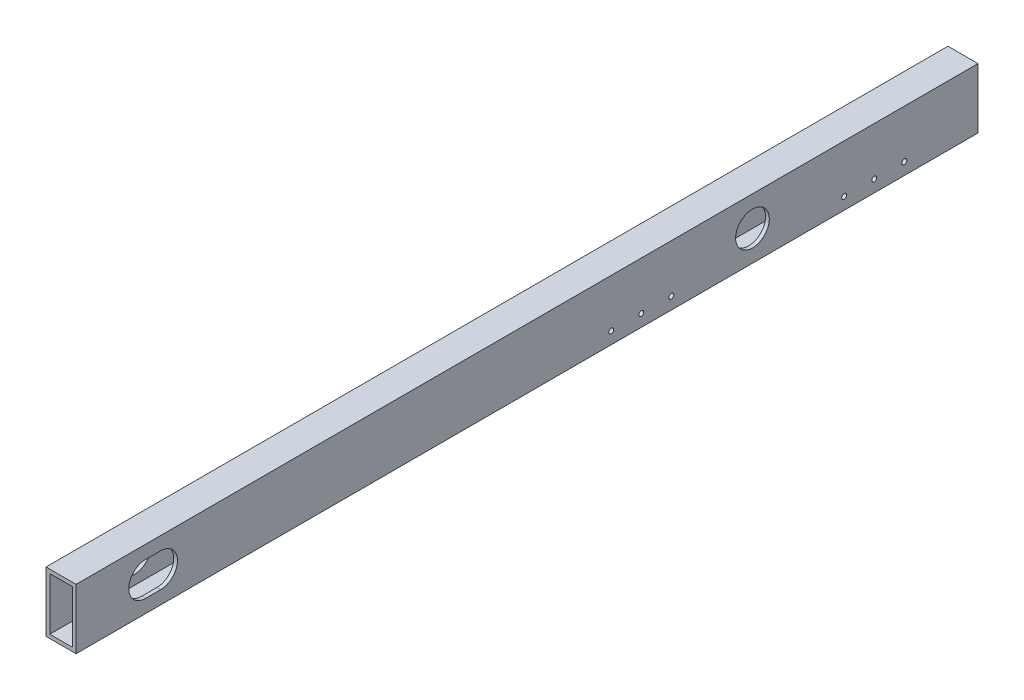
ISO-10303-21;
HEADER;
FILE_DESCRIPTION(('STEP AP214'),'2;1');
FILE_NAME('part.step','',(''),(''),'','','');
FILE_SCHEMA(('AUTOMOTIVE_DESIGN { 1 0 10303 214 1 1 1 1 }'));
ENDSEC;
DATA;
#1=APPLICATION_CONTEXT('core data for automotive mechanical design processes');
#2=APPLICATION_PROTOCOL_DEFINITION('international standard','automotive_design',2000,#1);
#3=PRODUCT_CONTEXT('',#1,'mechanical');
#4=PRODUCT('Part','Part','',(#3));
#5=PRODUCT_RELATED_PRODUCT_CATEGORY('part','',(#4));
#6=PRODUCT_DEFINITION_FORMATION('','',#4);
#7=PRODUCT_DEFINITION_CONTEXT('part definition',#1,'design');
#8=PRODUCT_DEFINITION('design','',#6,#7);
#9=PRODUCT_DEFINITION_SHAPE('','',#8);
#10=(LENGTH_UNIT() NAMED_UNIT(*) SI_UNIT(.MILLI.,.METRE.));
#11=(NAMED_UNIT(*) PLANE_ANGLE_UNIT() SI_UNIT($,.RADIAN.));
#12=(NAMED_UNIT(*) SI_UNIT($,.STERADIAN.) SOLID_ANGLE_UNIT());
#13=UNCERTAINTY_MEASURE_WITH_UNIT(LENGTH_MEASURE(1.E-05),#10,'distance_accuracy_value','');
#14=(GEOMETRIC_REPRESENTATION_CONTEXT(3) GLOBAL_UNCERTAINTY_ASSIGNED_CONTEXT((#13)) GLOBAL_UNIT_ASSIGNED_CONTEXT((#10,
#11,#12)) REPRESENTATION_CONTEXT('',''));
#15=CARTESIAN_POINT('',(0.,0.,0.));
#16=DIRECTION('',(0.,0.,1.));
#17=DIRECTION('',(1.,0.,0.));
#18=AXIS2_PLACEMENT_3D('',#15,#16,#17);
#19=CARTESIAN_POINT('',(0.,0.,762.));
#20=DIRECTION('',(0.,0.,1.));
#21=DIRECTION('',(1.,0.,0.));
#22=AXIS2_PLACEMENT_3D('',#19,#20,#21);
#23=PLANE('',#22);
#24=DIRECTION('',(0.,1.,0.));
#25=VECTOR('',#24,1.);
#26=CARTESIAN_POINT('',(12.7,25.4,762.));
#27=LINE('',#26,#25);
#28=CARTESIAN_POINT('',(12.7,-25.4,762.));
#29=VERTEX_POINT('',#28);
#30=CARTESIAN_POINT('',(12.7,25.4,762.));
#31=VERTEX_POINT('',#30);
#32=EDGE_CURVE('E251',#29,#31,#27,.T.);
#33=ORIENTED_EDGE('',*,*,#32,.T.);
#34=DIRECTION('',(-1.,0.,0.));
#35=VECTOR('',#34,1.);
#36=CARTESIAN_POINT('',(-12.7,25.4,762.));
#37=LINE('',#36,#35);
#38=CARTESIAN_POINT('',(-12.7,25.4,762.));
#39=VERTEX_POINT('',#38);
#40=EDGE_CURVE('E255',#31,#39,#37,.T.);
#41=ORIENTED_EDGE('',*,*,#40,.T.);
#42=DIRECTION('',(0.,-1.,0.));
#43=VECTOR('',#42,1.);
#44=CARTESIAN_POINT('',(-12.7,25.4,762.));
#45=LINE('',#44,#43);
#46=CARTESIAN_POINT('',(-12.7,-25.4,762.));
#47=VERTEX_POINT('',#46);
#48=EDGE_CURVE('E259',#39,#47,#45,.T.);
#49=ORIENTED_EDGE('',*,*,#48,.T.);
#50=DIRECTION('',(1.,0.,0.));
#51=VECTOR('',#50,1.);
#52=CARTESIAN_POINT('',(-12.7,-25.4,762.));
#53=LINE('',#52,#51);
#54=EDGE_CURVE('E262',#47,#29,#53,.T.);
#55=ORIENTED_EDGE('',*,*,#54,.T.);
#56=EDGE_LOOP('',(#33,#41,#49,#55));
#57=FACE_BOUND('',#56,.T.);
#58=DIRECTION('',(1.,0.,0.));
#59=VECTOR('',#58,1.);
#60=CARTESIAN_POINT('',(-9.525,-22.225,762.));
#61=LINE('',#60,#59);
#62=CARTESIAN_POINT('',(-9.525,-22.225,762.));
#63=VERTEX_POINT('',#62);
#64=CARTESIAN_POINT('',(9.52500000000002,-22.225,762.));
#65=VERTEX_POINT('',#64);
#66=EDGE_CURVE('E211',#63,#65,#61,.T.);
#67=ORIENTED_EDGE('',*,*,#66,.F.);
#68=DIRECTION('',(0.,-1.,0.));
#69=VECTOR('',#68,1.);
#70=CARTESIAN_POINT('',(-9.52500000000001,22.225,762.));
#71=LINE('',#70,#69);
#72=CARTESIAN_POINT('',(-9.52500000000001,22.225,762.));
#73=VERTEX_POINT('',#72);
#74=EDGE_CURVE('E208',#73,#63,#71,.T.);
#75=ORIENTED_EDGE('',*,*,#74,.F.);
#76=DIRECTION('',(-1.,0.,0.));
#77=VECTOR('',#76,1.);
#78=CARTESIAN_POINT('',(-9.52500000000001,22.225,762.));
#79=LINE('',#78,#77);
#80=CARTESIAN_POINT('',(9.52500000000001,22.225,762.));
#81=VERTEX_POINT('',#80);
#82=EDGE_CURVE('E219',#81,#73,#79,.T.);
#83=ORIENTED_EDGE('',*,*,#82,.F.);
#84=DIRECTION('',(0.,1.,0.));
#85=VECTOR('',#84,1.);
#86=CARTESIAN_POINT('',(9.52500000000001,22.225,762.));
#87=LINE('',#86,#85);
#88=EDGE_CURVE('E215',#65,#81,#87,.T.);
#89=ORIENTED_EDGE('',*,*,#88,.F.);
#90=EDGE_LOOP('',(#67,#75,#83,#89));
#91=FACE_BOUND('',#90,.T.);
#92=ADVANCED_FACE('F39',(#57,#91),#23,.T.);
#93=CARTESIAN_POINT('',(0.,0.,0.));
#94=DIRECTION('',(0.,0.,1.));
#95=DIRECTION('',(1.,0.,0.));
#96=AXIS2_PLACEMENT_3D('',#93,#94,#95);
#97=PLANE('',#96);
#98=DIRECTION('',(0.,1.,0.));
#99=VECTOR('',#98,1.);
#100=CARTESIAN_POINT('',(12.7,25.4,0.));
#101=LINE('',#100,#99);
#102=CARTESIAN_POINT('',(12.7,-25.4,0.));
#103=VERTEX_POINT('',#102);
#104=CARTESIAN_POINT('',(12.7,25.4,0.));
#105=VERTEX_POINT('',#104);
#106=EDGE_CURVE('E250',#103,#105,#101,.T.);
#107=ORIENTED_EDGE('',*,*,#106,.F.);
#108=DIRECTION('',(1.,0.,0.));
#109=VECTOR('',#108,1.);
#110=CARTESIAN_POINT('',(-12.7,-25.4,0.));
#111=LINE('',#110,#109);
#112=CARTESIAN_POINT('',(-12.7,-25.4,0.));
#113=VERTEX_POINT('',#112);
#114=EDGE_CURVE('E256',#113,#103,#111,.T.);
#115=ORIENTED_EDGE('',*,*,#114,.F.);
#116=DIRECTION('',(0.,-1.,0.));
#117=VECTOR('',#116,1.);
#118=CARTESIAN_POINT('',(-12.7,25.4,0.));
#119=LINE('',#118,#117);
#120=CARTESIAN_POINT('',(-12.7,25.4,0.));
#121=VERTEX_POINT('',#120);
#122=EDGE_CURVE('E272',#121,#113,#119,.T.);
#123=ORIENTED_EDGE('',*,*,#122,.F.);
#124=DIRECTION('',(-1.,0.,0.));
#125=VECTOR('',#124,1.);
#126=CARTESIAN_POINT('',(-12.7,25.4,0.));
#127=LINE('',#126,#125);
#128=EDGE_CURVE('E269',#105,#121,#127,.T.);
#129=ORIENTED_EDGE('',*,*,#128,.F.);
#130=EDGE_LOOP('',(#107,#115,#123,#129));
#131=FACE_BOUND('',#130,.T.);
#132=DIRECTION('',(0.,-1.,0.));
#133=VECTOR('',#132,1.);
#134=CARTESIAN_POINT('',(-9.52500000000001,22.225,0.));
#135=LINE('',#134,#133);
#136=CARTESIAN_POINT('',(-9.52500000000001,22.225,0.));
#137=VERTEX_POINT('',#136);
#138=CARTESIAN_POINT('',(-9.525,-22.225,0.));
#139=VERTEX_POINT('',#138);
#140=EDGE_CURVE('E207',#137,#139,#135,.T.);
#141=ORIENTED_EDGE('',*,*,#140,.T.);
#142=DIRECTION('',(1.,0.,0.));
#143=VECTOR('',#142,1.);
#144=CARTESIAN_POINT('',(-9.525,-22.225,0.));
#145=LINE('',#144,#143);
#146=CARTESIAN_POINT('',(9.52500000000002,-22.225,0.));
#147=VERTEX_POINT('',#146);
#148=EDGE_CURVE('E226',#139,#147,#145,.T.);
#149=ORIENTED_EDGE('',*,*,#148,.T.);
#150=DIRECTION('',(0.,1.,0.));
#151=VECTOR('',#150,1.);
#152=CARTESIAN_POINT('',(9.52500000000001,22.225,0.));
#153=LINE('',#152,#151);
#154=CARTESIAN_POINT('',(9.52500000000001,22.225,0.));
#155=VERTEX_POINT('',#154);
#156=EDGE_CURVE('E230',#147,#155,#153,.T.);
#157=ORIENTED_EDGE('',*,*,#156,.T.);
#158=DIRECTION('',(-1.,0.,0.));
#159=VECTOR('',#158,1.);
#160=CARTESIAN_POINT('',(-9.52500000000001,22.225,0.));
#161=LINE('',#160,#159);
#162=EDGE_CURVE('E212',#155,#137,#161,.T.);
#163=ORIENTED_EDGE('',*,*,#162,.T.);
#164=EDGE_LOOP('',(#141,#149,#157,#163));
#165=FACE_BOUND('',#164,.T.);
#166=ADVANCED_FACE('F446',(#131,#165),#97,.F.);
#167=CARTESIAN_POINT('',(12.7,25.4,762.));
#168=DIRECTION('',(-1.,0.,0.));
#169=DIRECTION('',(0.,0.,1.));
#170=AXIS2_PLACEMENT_3D('',#167,#168,#169);
#171=PLANE('',#170);
#172=CARTESIAN_POINT('',(12.7,-15.2400000000002,284.48));
#173=DIRECTION('',(1.,0.,0.));
#174=DIRECTION('',(0.,1.,0.));
#175=AXIS2_PLACEMENT_3D('',#172,#173,#174);
#176=CIRCLE('',#175,2.09549999999999);
#177=CARTESIAN_POINT('',(12.7,-13.1445000000002,284.48));
#178=VERTEX_POINT('',#177);
#179=EDGE_CURVE('E502',#178,#178,#176,.T.);
#180=ORIENTED_EDGE('',*,*,#179,.F.);
#181=EDGE_LOOP('',(#180));
#182=FACE_BOUND('',#181,.T.);
#183=CARTESIAN_POINT('',(12.7,-15.2400000000004,309.88));
#184=DIRECTION('',(1.,0.,0.));
#185=DIRECTION('',(0.,1.,0.));
#186=AXIS2_PLACEMENT_3D('',#183,#184,#185);
#187=CIRCLE('',#186,2.09549999999999);
#188=CARTESIAN_POINT('',(12.7,-13.1445000000004,309.88));
#189=VERTEX_POINT('',#188);
#190=EDGE_CURVE('E506',#189,#189,#187,.T.);
#191=ORIENTED_EDGE('',*,*,#190,.F.);
#192=EDGE_LOOP('',(#191));
#193=FACE_BOUND('',#192,.T.);
#194=CARTESIAN_POINT('',(12.7,-15.24,87.63));
#195=DIRECTION('',(1.,0.,0.));
#196=DIRECTION('',(0.,1.,0.));
#197=AXIS2_PLACEMENT_3D('',#194,#195,#196);
#198=CIRCLE('',#197,2.0955);
#199=CARTESIAN_POINT('',(12.7,-13.1445,87.63));
#200=VERTEX_POINT('',#199);
#201=EDGE_CURVE('E510',#200,#200,#198,.T.);
#202=ORIENTED_EDGE('',*,*,#201,.F.);
#203=EDGE_LOOP('',(#202));
#204=FACE_BOUND('',#203,.T.);
#205=CARTESIAN_POINT('',(12.7,-15.24,62.23));
#206=DIRECTION('',(1.,0.,0.));
#207=DIRECTION('',(0.,1.,0.));
#208=AXIS2_PLACEMENT_3D('',#205,#206,#207);
#209=CIRCLE('',#208,2.0955);
#210=CARTESIAN_POINT('',(12.7,-13.1445,62.23));
#211=VERTEX_POINT('',#210);
#212=EDGE_CURVE('E514',#211,#211,#209,.T.);
#213=ORIENTED_EDGE('',*,*,#212,.F.);
#214=EDGE_LOOP('',(#213));
#215=FACE_BOUND('',#214,.T.);
#216=CARTESIAN_POINT('',(12.7,-15.2400000000002,113.03));
#217=DIRECTION('',(1.,0.,0.));
#218=DIRECTION('',(0.,1.,0.));
#219=AXIS2_PLACEMENT_3D('',#216,#217,#218);
#220=CIRCLE('',#219,2.09549999999999);
#221=CARTESIAN_POINT('',(12.7,-13.1445000000002,113.03));
#222=VERTEX_POINT('',#221);
#223=EDGE_CURVE('E518',#222,#222,#220,.T.);
#224=ORIENTED_EDGE('',*,*,#223,.F.);
#225=EDGE_LOOP('',(#224));
#226=FACE_BOUND('',#225,.T.);
#227=CARTESIAN_POINT('',(12.7,-15.24,259.08));
#228=DIRECTION('',(1.,0.,0.));
#229=DIRECTION('',(0.,1.,0.));
#230=AXIS2_PLACEMENT_3D('',#227,#228,#229);
#231=CIRCLE('',#230,2.09549999999999);
#232=CARTESIAN_POINT('',(12.7,-13.1445,259.08));
#233=VERTEX_POINT('',#232);
#234=EDGE_CURVE('E522',#233,#233,#231,.T.);
#235=ORIENTED_EDGE('',*,*,#234,.F.);
#236=EDGE_LOOP('',(#235));
#237=FACE_BOUND('',#236,.T.);
#238=CARTESIAN_POINT('',(12.7,0.,190.549048410685));
#239=DIRECTION('',(1.,0.,0.));
#240=DIRECTION('',(0.,1.,0.));
#241=AXIS2_PLACEMENT_3D('',#238,#239,#240);
#242=CIRCLE('',#241,14.224);
#243=CARTESIAN_POINT('',(12.7,14.224,190.549048410685));
#244=VERTEX_POINT('',#243);
#245=EDGE_CURVE('E394',#244,#244,#242,.T.);
#246=ORIENTED_EDGE('',*,*,#245,.F.);
#247=EDGE_LOOP('',(#246));
#248=FACE_BOUND('',#247,.T.);
#249=DIRECTION('',(0.,0.,-1.));
#250=VECTOR('',#249,1.);
#251=CARTESIAN_POINT('',(12.7,-14.2240000000001,703.248048410685));
#252=LINE('',#251,#250);
#253=CARTESIAN_POINT('',(12.7,-14.2240000000001,703.248048410685));
#254=VERTEX_POINT('',#253);
#255=CARTESIAN_POINT('',(12.7,-14.2240000000001,690.548048410685));
#256=VERTEX_POINT('',#255);
#257=EDGE_CURVE('E418',#254,#256,#252,.T.);
#258=ORIENTED_EDGE('',*,*,#257,.F.);
#259=CARTESIAN_POINT('',(12.7,0.,703.248048410685));
#260=DIRECTION('',(1.,0.,0.));
#261=DIRECTION('',(0.,1.,0.));
#262=AXIS2_PLACEMENT_3D('',#259,#260,#261);
#263=CIRCLE('',#262,14.2240000000001);
#264=CARTESIAN_POINT('',(12.7,14.2240000000001,703.248048410685));
#265=VERTEX_POINT('',#264);
#266=EDGE_CURVE('E57',#265,#254,#263,.T.);
#267=ORIENTED_EDGE('',*,*,#266,.F.);
#268=DIRECTION('',(0.,0.,-1.));
#269=VECTOR('',#268,1.);
#270=CARTESIAN_POINT('',(12.7,14.2240000000001,703.248048410685));
#271=LINE('',#270,#269);
#272=CARTESIAN_POINT('',(12.7,14.224,690.548048410685));
#273=VERTEX_POINT('',#272);
#274=EDGE_CURVE('E406',#265,#273,#271,.T.);
#275=ORIENTED_EDGE('',*,*,#274,.T.);
#276=CARTESIAN_POINT('',(12.7,0.,690.548048410685));
#277=DIRECTION('',(1.,0.,0.));
#278=DIRECTION('',(0.,1.,0.));
#279=AXIS2_PLACEMENT_3D('',#276,#277,#278);
#280=CIRCLE('',#279,14.2240000000001);
#281=EDGE_CURVE('E414',#256,#273,#280,.T.);
#282=ORIENTED_EDGE('',*,*,#281,.F.);
#283=EDGE_LOOP('',(#258,#267,#275,#282));
#284=FACE_BOUND('',#283,.T.);
#285=ORIENTED_EDGE('',*,*,#106,.T.);
#286=DIRECTION('',(0.,0.,-1.));
#287=VECTOR('',#286,1.);
#288=CARTESIAN_POINT('',(12.7,25.4,762.));
#289=LINE('',#288,#287);
#290=EDGE_CURVE('E288',#31,#105,#289,.T.);
#291=ORIENTED_EDGE('',*,*,#290,.F.);
#292=ORIENTED_EDGE('',*,*,#32,.F.);
#293=DIRECTION('',(0.,0.,-1.));
#294=VECTOR('',#293,1.);
#295=CARTESIAN_POINT('',(12.7,-25.4,762.));
#296=LINE('',#295,#294);
#297=EDGE_CURVE('E265',#29,#103,#296,.T.);
#298=ORIENTED_EDGE('',*,*,#297,.T.);
#299=EDGE_LOOP('',(#285,#291,#292,#298));
#300=FACE_BOUND('',#299,.T.);
#301=ADVANCED_FACE('F41',(#182,#193,#204,#215,#226,#237,#248,#284,#300),#171,.F.);
#302=CARTESIAN_POINT('',(-12.7,25.4,762.));
#303=DIRECTION('',(0.,-1.,0.));
#304=DIRECTION('',(0.,0.,-1.));
#305=AXIS2_PLACEMENT_3D('',#302,#303,#304);
#306=PLANE('',#305);
#307=ORIENTED_EDGE('',*,*,#128,.T.);
#308=DIRECTION('',(0.,0.,-1.));
#309=VECTOR('',#308,1.);
#310=CARTESIAN_POINT('',(-12.7,25.4,762.));
#311=LINE('',#310,#309);
#312=EDGE_CURVE('E284',#39,#121,#311,.T.);
#313=ORIENTED_EDGE('',*,*,#312,.F.);
#314=ORIENTED_EDGE('',*,*,#40,.F.);
#315=ORIENTED_EDGE('',*,*,#290,.T.);
#316=EDGE_LOOP('',(#307,#313,#314,#315));
#317=FACE_BOUND('',#316,.T.);
#318=ADVANCED_FACE('F477',(#317),#306,.F.);
#319=CARTESIAN_POINT('',(-12.7,25.4,762.));
#320=DIRECTION('',(1.,0.,0.));
#321=DIRECTION('',(0.,0.,-1.));
#322=AXIS2_PLACEMENT_3D('',#319,#320,#321);
#323=PLANE('',#322);
#324=CARTESIAN_POINT('',(-12.7,-15.2400000000002,284.48));
#325=DIRECTION('',(1.,0.,0.));
#326=DIRECTION('',(0.,0.,-1.));
#327=AXIS2_PLACEMENT_3D('',#324,#325,#326);
#328=CIRCLE('',#327,2.09549999999999);
#329=CARTESIAN_POINT('',(-12.7,-15.2400000000002,282.3845));
#330=VERTEX_POINT('',#329);
#331=EDGE_CURVE('E661',#330,#330,#328,.F.);
#332=ORIENTED_EDGE('',*,*,#331,.F.);
#333=EDGE_LOOP('',(#332));
#334=FACE_BOUND('',#333,.T.);
#335=CARTESIAN_POINT('',(-12.7,-15.2400000000004,309.88));
#336=DIRECTION('',(1.,0.,0.));
#337=DIRECTION('',(0.,0.,-1.));
#338=AXIS2_PLACEMENT_3D('',#335,#336,#337);
#339=CIRCLE('',#338,2.09549999999999);
#340=CARTESIAN_POINT('',(-12.7,-15.2400000000004,307.7845));
#341=VERTEX_POINT('',#340);
#342=EDGE_CURVE('E662',#341,#341,#339,.F.);
#343=ORIENTED_EDGE('',*,*,#342,.F.);
#344=EDGE_LOOP('',(#343));
#345=FACE_BOUND('',#344,.T.);
#346=CARTESIAN_POINT('',(-12.7,-15.24,87.63));
#347=DIRECTION('',(1.,0.,0.));
#348=DIRECTION('',(0.,0.,-1.));
#349=AXIS2_PLACEMENT_3D('',#346,#347,#348);
#350=CIRCLE('',#349,2.0955);
#351=CARTESIAN_POINT('',(-12.7,-15.24,85.5345));
#352=VERTEX_POINT('',#351);
#353=EDGE_CURVE('E668',#352,#352,#350,.F.);
#354=ORIENTED_EDGE('',*,*,#353,.F.);
#355=EDGE_LOOP('',(#354));
#356=FACE_BOUND('',#355,.T.);
#357=CARTESIAN_POINT('',(-12.7,-15.24,62.23));
#358=DIRECTION('',(1.,0.,0.));
#359=DIRECTION('',(0.,0.,-1.));
#360=AXIS2_PLACEMENT_3D('',#357,#358,#359);
#361=CIRCLE('',#360,2.0955);
#362=CARTESIAN_POINT('',(-12.7,-15.24,60.1345));
#363=VERTEX_POINT('',#362);
#364=EDGE_CURVE('E655',#363,#363,#361,.F.);
#365=ORIENTED_EDGE('',*,*,#364,.F.);
#366=EDGE_LOOP('',(#365));
#367=FACE_BOUND('',#366,.T.);
#368=CARTESIAN_POINT('',(-12.7,-15.2400000000002,113.03));
#369=DIRECTION('',(1.,0.,0.));
#370=DIRECTION('',(0.,0.,-1.));
#371=AXIS2_PLACEMENT_3D('',#368,#369,#370);
#372=CIRCLE('',#371,2.09549999999999);
#373=CARTESIAN_POINT('',(-12.7,-15.2400000000002,110.9345));
#374=VERTEX_POINT('',#373);
#375=EDGE_CURVE('E649',#374,#374,#372,.F.);
#376=ORIENTED_EDGE('',*,*,#375,.F.);
#377=EDGE_LOOP('',(#376));
#378=FACE_BOUND('',#377,.T.);
#379=CARTESIAN_POINT('',(-12.7,-15.24,259.08));
#380=DIRECTION('',(1.,0.,0.));
#381=DIRECTION('',(0.,0.,-1.));
#382=AXIS2_PLACEMENT_3D('',#379,#380,#381);
#383=CIRCLE('',#382,2.09549999999999);
#384=CARTESIAN_POINT('',(-12.7,-15.24,256.9845));
#385=VERTEX_POINT('',#384);
#386=EDGE_CURVE('E310',#385,#385,#383,.F.);
#387=ORIENTED_EDGE('',*,*,#386,.F.);
#388=EDGE_LOOP('',(#387));
#389=FACE_BOUND('',#388,.T.);
#390=CARTESIAN_POINT('',(-12.7,0.,190.549048410685));
#391=DIRECTION('',(1.,0.,0.));
#392=DIRECTION('',(0.,0.,-1.));
#393=AXIS2_PLACEMENT_3D('',#390,#391,#392);
#394=CIRCLE('',#393,14.224);
#395=CARTESIAN_POINT('',(-12.7,0.,176.325048410685));
#396=VERTEX_POINT('',#395);
#397=EDGE_CURVE('E192',#396,#396,#394,.F.);
#398=ORIENTED_EDGE('',*,*,#397,.F.);
#399=EDGE_LOOP('',(#398));
#400=FACE_BOUND('',#399,.T.);
#401=DIRECTION('',(0.,0.,1.));
#402=VECTOR('',#401,1.);
#403=CARTESIAN_POINT('',(-12.7,14.224,703.248048410685));
#404=LINE('',#403,#402);
#405=CARTESIAN_POINT('',(-12.7,14.224,690.548048410685));
#406=VERTEX_POINT('',#405);
#407=CARTESIAN_POINT('',(-12.7,14.224,703.248048410685));
#408=VERTEX_POINT('',#407);
#409=EDGE_CURVE('E156',#406,#408,#404,.T.);
#410=ORIENTED_EDGE('',*,*,#409,.T.);
#411=CARTESIAN_POINT('',(-12.7,0.,703.248048410685));
#412=DIRECTION('',(1.,0.,0.));
#413=DIRECTION('',(0.,0.,-1.));
#414=AXIS2_PLACEMENT_3D('',#411,#412,#413);
#415=CIRCLE('',#414,14.2240000000001);
#416=CARTESIAN_POINT('',(-12.7,-14.2240000000001,703.248048410685));
#417=VERTEX_POINT('',#416);
#418=EDGE_CURVE('E168',#417,#408,#415,.F.);
#419=ORIENTED_EDGE('',*,*,#418,.F.);
#420=DIRECTION('',(0.,0.,1.));
#421=VECTOR('',#420,1.);
#422=CARTESIAN_POINT('',(-12.7,-14.2240000000001,703.248048410685));
#423=LINE('',#422,#421);
#424=CARTESIAN_POINT('',(-12.7,-14.2240000000001,690.548048410685));
#425=VERTEX_POINT('',#424);
#426=EDGE_CURVE('E181',#425,#417,#423,.T.);
#427=ORIENTED_EDGE('',*,*,#426,.F.);
#428=CARTESIAN_POINT('',(-12.7,0.,690.548048410685));
#429=DIRECTION('',(1.,0.,0.));
#430=DIRECTION('',(0.,0.,-1.));
#431=AXIS2_PLACEMENT_3D('',#428,#429,#430);
#432=CIRCLE('',#431,14.2240000000001);
#433=EDGE_CURVE('E167',#406,#425,#432,.F.);
#434=ORIENTED_EDGE('',*,*,#433,.F.);
#435=EDGE_LOOP('',(#410,#419,#427,#434));
#436=FACE_BOUND('',#435,.T.);
#437=ORIENTED_EDGE('',*,*,#122,.T.);
#438=DIRECTION('',(0.,0.,-1.));
#439=VECTOR('',#438,1.);
#440=CARTESIAN_POINT('',(-12.7,-25.4,762.));
#441=LINE('',#440,#439);
#442=EDGE_CURVE('E280',#47,#113,#441,.T.);
#443=ORIENTED_EDGE('',*,*,#442,.F.);
#444=ORIENTED_EDGE('',*,*,#48,.F.);
#445=ORIENTED_EDGE('',*,*,#312,.T.);
#446=EDGE_LOOP('',(#437,#443,#444,#445));
#447=FACE_BOUND('',#446,.T.);
#448=ADVANCED_FACE('F179',(#334,#345,#356,#367,#378,#389,#400,#436,#447),#323,.F.);
#449=CARTESIAN_POINT('',(-12.7,-25.4,762.));
#450=DIRECTION('',(0.,1.,0.));
#451=DIRECTION('',(0.,0.,1.));
#452=AXIS2_PLACEMENT_3D('',#449,#450,#451);
#453=PLANE('',#452);
#454=CARTESIAN_POINT('',(2.53999999999982,-25.4,289.56));
#455=DIRECTION('',(0.,-1.,0.));
#456=DIRECTION('',(0.,0.,-1.));
#457=AXIS2_PLACEMENT_3D('',#454,#455,#456);
#458=CIRCLE('',#457,2.09549999999999);
#459=CARTESIAN_POINT('',(2.53999999999982,-25.4,287.4645));
#460=VERTEX_POINT('',#459);
#461=EDGE_CURVE('E355',#460,#460,#458,.T.);
#462=ORIENTED_EDGE('',*,*,#461,.F.);
#463=EDGE_LOOP('',(#462));
#464=FACE_BOUND('',#463,.T.);
#465=CARTESIAN_POINT('',(2.53999999999973,-25.4,314.96));
#466=DIRECTION('',(0.,-1.,0.));
#467=DIRECTION('',(0.,0.,-1.));
#468=AXIS2_PLACEMENT_3D('',#465,#466,#467);
#469=CIRCLE('',#468,2.09549999999999);
#470=CARTESIAN_POINT('',(2.53999999999973,-25.4,312.8645));
#471=VERTEX_POINT('',#470);
#472=EDGE_CURVE('E365',#471,#471,#469,.T.);
#473=ORIENTED_EDGE('',*,*,#472,.F.);
#474=EDGE_LOOP('',(#473));
#475=FACE_BOUND('',#474,.T.);
#476=CARTESIAN_POINT('',(-2.5400000000001,-25.4,264.16));
#477=DIRECTION('',(0.,-1.,0.));
#478=DIRECTION('',(0.,0.,1.));
#479=AXIS2_PLACEMENT_3D('',#476,#477,#478);
#480=CIRCLE('',#479,2.09549999999999);
#481=CARTESIAN_POINT('',(-2.5400000000001,-25.4,266.2555));
#482=VERTEX_POINT('',#481);
#483=EDGE_CURVE('E373',#482,#482,#480,.T.);
#484=ORIENTED_EDGE('',*,*,#483,.F.);
#485=EDGE_LOOP('',(#484));
#486=FACE_BOUND('',#485,.T.);
#487=CARTESIAN_POINT('',(-2.53999999999987,-25.4,289.56));
#488=DIRECTION('',(0.,-1.,0.));
#489=DIRECTION('',(0.,0.,1.));
#490=AXIS2_PLACEMENT_3D('',#487,#488,#489);
#491=CIRCLE('',#490,2.09549999999999);
#492=CARTESIAN_POINT('',(-2.53999999999987,-25.4,291.6555));
#493=VERTEX_POINT('',#492);
#494=EDGE_CURVE('E354',#493,#493,#491,.T.);
#495=ORIENTED_EDGE('',*,*,#494,.F.);
#496=EDGE_LOOP('',(#495));
#497=FACE_BOUND('',#496,.T.);
#498=CARTESIAN_POINT('',(-2.53999999999963,-25.4,314.96));
#499=DIRECTION('',(0.,-1.,0.));
#500=DIRECTION('',(0.,0.,1.));
#501=AXIS2_PLACEMENT_3D('',#498,#499,#500);
#502=CIRCLE('',#501,2.09549999999999);
#503=CARTESIAN_POINT('',(-2.53999999999963,-25.4,317.0555));
#504=VERTEX_POINT('',#503);
#505=EDGE_CURVE('E346',#504,#504,#502,.T.);
#506=ORIENTED_EDGE('',*,*,#505,.F.);
#507=EDGE_LOOP('',(#506));
#508=FACE_BOUND('',#507,.T.);
#509=CARTESIAN_POINT('',(2.53999999999991,-25.4,264.16));
#510=DIRECTION('',(0.,-1.,0.));
#511=DIRECTION('',(0.,0.,-1.));
#512=AXIS2_PLACEMENT_3D('',#509,#510,#511);
#513=CIRCLE('',#512,2.09549999999999);
#514=CARTESIAN_POINT('',(2.53999999999991,-25.4,262.0645));
#515=VERTEX_POINT('',#514);
#516=EDGE_CURVE('E364',#515,#515,#513,.T.);
#517=ORIENTED_EDGE('',*,*,#516,.F.);
#518=EDGE_LOOP('',(#517));
#519=FACE_BOUND('',#518,.T.);
#520=ORIENTED_EDGE('',*,*,#114,.T.);
#521=ORIENTED_EDGE('',*,*,#297,.F.);
#522=ORIENTED_EDGE('',*,*,#54,.F.);
#523=ORIENTED_EDGE('',*,*,#442,.T.);
#524=EDGE_LOOP('',(#520,#521,#522,#523));
#525=FACE_BOUND('',#524,.T.);
#526=ADVANCED_FACE('F435',(#464,#475,#486,#497,#508,#519,#525),#453,.F.);
#527=CARTESIAN_POINT('',(-9.52500000000001,22.225,762.));
#528=DIRECTION('',(1.,0.,0.));
#529=DIRECTION('',(0.,1.,0.));
#530=AXIS2_PLACEMENT_3D('',#527,#528,#529);
#531=PLANE('',#530);
#532=CARTESIAN_POINT('',(-9.525,-15.2400000000002,284.48));
#533=DIRECTION('',(1.,0.,0.));
#534=DIRECTION('',(0.,1.,0.));
#535=AXIS2_PLACEMENT_3D('',#532,#533,#534);
#536=CIRCLE('',#535,2.09549999999999);
#537=CARTESIAN_POINT('',(-9.525,-13.1445000000002,284.48));
#538=VERTEX_POINT('',#537);
#539=EDGE_CURVE('E342',#538,#538,#536,.T.);
#540=ORIENTED_EDGE('',*,*,#539,.F.);
#541=EDGE_LOOP('',(#540));
#542=FACE_BOUND('',#541,.T.);
#543=CARTESIAN_POINT('',(-9.525,-15.2400000000004,309.88));
#544=DIRECTION('',(1.,0.,0.));
#545=DIRECTION('',(0.,1.,0.));
#546=AXIS2_PLACEMENT_3D('',#543,#544,#545);
#547=CIRCLE('',#546,2.09549999999999);
#548=CARTESIAN_POINT('',(-9.525,-13.1445000000004,309.88));
#549=VERTEX_POINT('',#548);
#550=EDGE_CURVE('E328',#549,#549,#547,.T.);
#551=ORIENTED_EDGE('',*,*,#550,.F.);
#552=EDGE_LOOP('',(#551));
#553=FACE_BOUND('',#552,.T.);
#554=CARTESIAN_POINT('',(-9.525,-15.24,87.63));
#555=DIRECTION('',(1.,0.,0.));
#556=DIRECTION('',(0.,1.,0.));
#557=AXIS2_PLACEMENT_3D('',#554,#555,#556);
#558=CIRCLE('',#557,2.0955);
#559=CARTESIAN_POINT('',(-9.525,-13.1445,87.63));
#560=VERTEX_POINT('',#559);
#561=EDGE_CURVE('E324',#560,#560,#558,.T.);
#562=ORIENTED_EDGE('',*,*,#561,.F.);
#563=EDGE_LOOP('',(#562));
#564=FACE_BOUND('',#563,.T.);
#565=CARTESIAN_POINT('',(-9.525,-15.24,62.23));
#566=DIRECTION('',(1.,0.,0.));
#567=DIRECTION('',(0.,1.,0.));
#568=AXIS2_PLACEMENT_3D('',#565,#566,#567);
#569=CIRCLE('',#568,2.0955);
#570=CARTESIAN_POINT('',(-9.525,-13.1445,62.23));
#571=VERTEX_POINT('',#570);
#572=EDGE_CURVE('E320',#571,#571,#569,.T.);
#573=ORIENTED_EDGE('',*,*,#572,.F.);
#574=EDGE_LOOP('',(#573));
#575=FACE_BOUND('',#574,.T.);
#576=CARTESIAN_POINT('',(-9.525,-15.2400000000002,113.03));
#577=DIRECTION('',(1.,0.,0.));
#578=DIRECTION('',(0.,1.,0.));
#579=AXIS2_PLACEMENT_3D('',#576,#577,#578);
#580=CIRCLE('',#579,2.09549999999999);
#581=CARTESIAN_POINT('',(-9.525,-13.1445000000002,113.03));
#582=VERTEX_POINT('',#581);
#583=EDGE_CURVE('E315',#582,#582,#580,.T.);
#584=ORIENTED_EDGE('',*,*,#583,.F.);
#585=EDGE_LOOP('',(#584));
#586=FACE_BOUND('',#585,.T.);
#587=CARTESIAN_POINT('',(-9.525,-15.24,259.08));
#588=DIRECTION('',(1.,0.,0.));
#589=DIRECTION('',(0.,1.,0.));
#590=AXIS2_PLACEMENT_3D('',#587,#588,#589);
#591=CIRCLE('',#590,2.09549999999999);
#592=CARTESIAN_POINT('',(-9.525,-13.1445,259.08));
#593=VERTEX_POINT('',#592);
#594=EDGE_CURVE('E309',#593,#593,#591,.T.);
#595=ORIENTED_EDGE('',*,*,#594,.F.);
#596=EDGE_LOOP('',(#595));
#597=FACE_BOUND('',#596,.T.);
#598=CARTESIAN_POINT('',(-9.52500000000001,0.,190.549048410685));
#599=DIRECTION('',(1.,0.,0.));
#600=DIRECTION('',(0.,1.,0.));
#601=AXIS2_PLACEMENT_3D('',#598,#599,#600);
#602=CIRCLE('',#601,14.224);
#603=CARTESIAN_POINT('',(-9.52500000000001,14.224,190.549048410685));
#604=VERTEX_POINT('',#603);
#605=EDGE_CURVE('E203',#604,#604,#602,.T.);
#606=ORIENTED_EDGE('',*,*,#605,.F.);
#607=EDGE_LOOP('',(#606));
#608=FACE_BOUND('',#607,.T.);
#609=CARTESIAN_POINT('',(-9.52500000000001,0.,703.248048410685));
#610=DIRECTION('',(1.,0.,0.));
#611=DIRECTION('',(0.,1.,0.));
#612=AXIS2_PLACEMENT_3D('',#609,#610,#611);
#613=CIRCLE('',#612,14.2240000000001);
#614=CARTESIAN_POINT('',(-9.52500000000001,14.224,703.248048410685));
#615=VERTEX_POINT('',#614);
#616=CARTESIAN_POINT('',(-9.525,-14.2240000000001,703.248048410685));
#617=VERTEX_POINT('',#616);
#618=EDGE_CURVE('E198',#615,#617,#613,.T.);
#619=ORIENTED_EDGE('',*,*,#618,.F.);
#620=DIRECTION('',(0.,0.,-1.));
#621=VECTOR('',#620,1.);
#622=CARTESIAN_POINT('',(-9.52500000000001,14.2240000000003,762.));
#623=LINE('',#622,#621);
#624=CARTESIAN_POINT('',(-9.52500000000001,14.224,690.548048410685));
#625=VERTEX_POINT('',#624);
#626=EDGE_CURVE('E195',#615,#625,#623,.T.);
#627=ORIENTED_EDGE('',*,*,#626,.T.);
#628=CARTESIAN_POINT('',(-9.52500000000001,0.,690.548048410685));
#629=DIRECTION('',(1.,0.,0.));
#630=DIRECTION('',(0.,1.,0.));
#631=AXIS2_PLACEMENT_3D('',#628,#629,#630);
#632=CIRCLE('',#631,14.2240000000001);
#633=CARTESIAN_POINT('',(-9.52500000000001,-14.2240000000001,690.548048410685));
#634=VERTEX_POINT('',#633);
#635=EDGE_CURVE('E174',#634,#625,#632,.T.);
#636=ORIENTED_EDGE('',*,*,#635,.F.);
#637=DIRECTION('',(0.,0.,-1.));
#638=VECTOR('',#637,1.);
#639=CARTESIAN_POINT('',(-9.525,-14.2239999999998,762.));
#640=LINE('',#639,#638);
#641=EDGE_CURVE('E189',#617,#634,#640,.T.);
#642=ORIENTED_EDGE('',*,*,#641,.F.);
#643=EDGE_LOOP('',(#619,#627,#636,#642));
#644=FACE_BOUND('',#643,.T.);
#645=ORIENTED_EDGE('',*,*,#140,.F.);
#646=DIRECTION('',(0.,0.,-1.));
#647=VECTOR('',#646,1.);
#648=CARTESIAN_POINT('',(-9.52500000000001,22.225,762.));
#649=LINE('',#648,#647);
#650=EDGE_CURVE('E222',#73,#137,#649,.T.);
#651=ORIENTED_EDGE('',*,*,#650,.F.);
#652=ORIENTED_EDGE('',*,*,#74,.T.);
#653=DIRECTION('',(0.,0.,-1.));
#654=VECTOR('',#653,1.);
#655=CARTESIAN_POINT('',(-9.525,-22.225,762.));
#656=LINE('',#655,#654);
#657=EDGE_CURVE('E246',#63,#139,#656,.T.);
#658=ORIENTED_EDGE('',*,*,#657,.T.);
#659=EDGE_LOOP('',(#645,#651,#652,#658));
#660=FACE_BOUND('',#659,.T.);
#661=ADVANCED_FACE('F431',(#542,#553,#564,#575,#586,#597,#608,#644,#660),#531,.T.);
#662=CARTESIAN_POINT('',(-9.525,-22.225,762.));
#663=DIRECTION('',(0.,1.,0.));
#664=DIRECTION('',(-1.,0.,0.));
#665=AXIS2_PLACEMENT_3D('',#662,#663,#664);
#666=PLANE('',#665);
#667=CARTESIAN_POINT('',(2.53999999999982,-22.225,289.56));
#668=DIRECTION('',(0.,1.,0.));
#669=DIRECTION('',(-1.,0.,0.));
#670=AXIS2_PLACEMENT_3D('',#667,#668,#669);
#671=CIRCLE('',#670,2.09549999999999);
#672=CARTESIAN_POINT('',(0.444499999999827,-22.225,289.56));
#673=VERTEX_POINT('',#672);
#674=EDGE_CURVE('E359',#673,#673,#671,.F.);
#675=ORIENTED_EDGE('',*,*,#674,.T.);
#676=EDGE_LOOP('',(#675));
#677=FACE_BOUND('',#676,.T.);
#678=CARTESIAN_POINT('',(2.53999999999973,-22.225,314.96));
#679=DIRECTION('',(0.,1.,0.));
#680=DIRECTION('',(-1.,0.,0.));
#681=AXIS2_PLACEMENT_3D('',#678,#679,#680);
#682=CIRCLE('',#681,2.09549999999999);
#683=CARTESIAN_POINT('',(0.444499999999737,-22.225,314.96));
#684=VERTEX_POINT('',#683);
#685=EDGE_CURVE('E360',#684,#684,#682,.F.);
#686=ORIENTED_EDGE('',*,*,#685,.T.);
#687=EDGE_LOOP('',(#686));
#688=FACE_BOUND('',#687,.T.);
#689=CARTESIAN_POINT('',(-2.5400000000001,-22.225,264.16));
#690=DIRECTION('',(0.,1.,0.));
#691=DIRECTION('',(-1.,0.,0.));
#692=AXIS2_PLACEMENT_3D('',#689,#690,#691);
#693=CIRCLE('',#692,2.09549999999999);
#694=CARTESIAN_POINT('',(-4.63550000000009,-22.225,264.16));
#695=VERTEX_POINT('',#694);
#696=EDGE_CURVE('E369',#695,#695,#693,.F.);
#697=ORIENTED_EDGE('',*,*,#696,.T.);
#698=EDGE_LOOP('',(#697));
#699=FACE_BOUND('',#698,.T.);
#700=CARTESIAN_POINT('',(-2.53999999999987,-22.225,289.56));
#701=DIRECTION('',(0.,1.,0.));
#702=DIRECTION('',(-1.,0.,0.));
#703=AXIS2_PLACEMENT_3D('',#700,#701,#702);
#704=CIRCLE('',#703,2.09549999999999);
#705=CARTESIAN_POINT('',(-4.63549999999986,-22.225,289.56));
#706=VERTEX_POINT('',#705);
#707=EDGE_CURVE('E377',#706,#706,#704,.F.);
#708=ORIENTED_EDGE('',*,*,#707,.T.);
#709=EDGE_LOOP('',(#708));
#710=FACE_BOUND('',#709,.T.);
#711=CARTESIAN_POINT('',(-2.53999999999963,-22.225,314.96));
#712=DIRECTION('',(0.,1.,0.));
#713=DIRECTION('',(-1.,0.,0.));
#714=AXIS2_PLACEMENT_3D('',#711,#712,#713);
#715=CIRCLE('',#714,2.09549999999999);
#716=CARTESIAN_POINT('',(-4.63549999999962,-22.225,314.96));
#717=VERTEX_POINT('',#716);
#718=EDGE_CURVE('E350',#717,#717,#715,.F.);
#719=ORIENTED_EDGE('',*,*,#718,.T.);
#720=EDGE_LOOP('',(#719));
#721=FACE_BOUND('',#720,.T.);
#722=CARTESIAN_POINT('',(2.53999999999991,-22.225,264.16));
#723=DIRECTION('',(0.,1.,0.));
#724=DIRECTION('',(-1.,0.,0.));
#725=AXIS2_PLACEMENT_3D('',#722,#723,#724);
#726=CIRCLE('',#725,2.09549999999999);
#727=CARTESIAN_POINT('',(0.444499999999914,-22.225,264.16));
#728=VERTEX_POINT('',#727);
#729=EDGE_CURVE('E390',#728,#728,#726,.F.);
#730=ORIENTED_EDGE('',*,*,#729,.T.);
#731=EDGE_LOOP('',(#730));
#732=FACE_BOUND('',#731,.T.);
#733=ORIENTED_EDGE('',*,*,#148,.F.);
#734=ORIENTED_EDGE('',*,*,#657,.F.);
#735=ORIENTED_EDGE('',*,*,#66,.T.);
#736=DIRECTION('',(0.,0.,-1.));
#737=VECTOR('',#736,1.);
#738=CARTESIAN_POINT('',(9.52500000000002,-22.225,762.));
#739=LINE('',#738,#737);
#740=EDGE_CURVE('E243',#65,#147,#739,.T.);
#741=ORIENTED_EDGE('',*,*,#740,.T.);
#742=EDGE_LOOP('',(#733,#734,#735,#741));
#743=FACE_BOUND('',#742,.T.);
#744=ADVANCED_FACE('F434',(#677,#688,#699,#710,#721,#732,#743),#666,.T.);
#745=CARTESIAN_POINT('',(9.52500000000001,22.225,762.));
#746=DIRECTION('',(-1.,0.,0.));
#747=DIRECTION('',(0.,-1.,0.));
#748=AXIS2_PLACEMENT_3D('',#745,#746,#747);
#749=PLANE('',#748);
#750=CARTESIAN_POINT('',(9.52500000000002,-15.2400000000002,284.48));
#751=DIRECTION('',(-1.,0.,0.));
#752=DIRECTION('',(0.,-1.,0.));
#753=AXIS2_PLACEMENT_3D('',#750,#751,#752);
#754=CIRCLE('',#753,2.09549999999999);
#755=CARTESIAN_POINT('',(9.52500000000002,-17.3355000000002,284.48));
#756=VERTEX_POINT('',#755);
#757=EDGE_CURVE('E43',#756,#756,#754,.T.);
#758=ORIENTED_EDGE('',*,*,#757,.F.);
#759=EDGE_LOOP('',(#758));
#760=FACE_BOUND('',#759,.T.);
#761=CARTESIAN_POINT('',(9.52500000000002,-15.2400000000004,309.88));
#762=DIRECTION('',(-1.,0.,0.));
#763=DIRECTION('',(0.,-1.,0.));
#764=AXIS2_PLACEMENT_3D('',#761,#762,#763);
#765=CIRCLE('',#764,2.09549999999999);
#766=CARTESIAN_POINT('',(9.52500000000002,-17.3355000000004,309.88));
#767=VERTEX_POINT('',#766);
#768=EDGE_CURVE('E325',#767,#767,#765,.T.);
#769=ORIENTED_EDGE('',*,*,#768,.F.);
#770=EDGE_LOOP('',(#769));
#771=FACE_BOUND('',#770,.T.);
#772=CARTESIAN_POINT('',(9.52500000000002,-15.24,87.63));
#773=DIRECTION('',(-1.,0.,0.));
#774=DIRECTION('',(0.,-1.,0.));
#775=AXIS2_PLACEMENT_3D('',#772,#773,#774);
#776=CIRCLE('',#775,2.0955);
#777=CARTESIAN_POINT('',(9.52500000000002,-17.3355,87.63));
#778=VERTEX_POINT('',#777);
#779=EDGE_CURVE('E321',#778,#778,#776,.T.);
#780=ORIENTED_EDGE('',*,*,#779,.F.);
#781=EDGE_LOOP('',(#780));
#782=FACE_BOUND('',#781,.T.);
#783=CARTESIAN_POINT('',(9.52500000000002,-15.24,62.23));
#784=DIRECTION('',(-1.,0.,0.));
#785=DIRECTION('',(0.,-1.,0.));
#786=AXIS2_PLACEMENT_3D('',#783,#784,#785);
#787=CIRCLE('',#786,2.0955);
#788=CARTESIAN_POINT('',(9.52500000000002,-17.3355,62.23));
#789=VERTEX_POINT('',#788);
#790=EDGE_CURVE('E316',#789,#789,#787,.T.);
#791=ORIENTED_EDGE('',*,*,#790,.F.);
#792=EDGE_LOOP('',(#791));
#793=FACE_BOUND('',#792,.T.);
#794=CARTESIAN_POINT('',(9.52500000000002,-15.2400000000002,113.03));
#795=DIRECTION('',(-1.,0.,0.));
#796=DIRECTION('',(0.,-1.,0.));
#797=AXIS2_PLACEMENT_3D('',#794,#795,#796);
#798=CIRCLE('',#797,2.09549999999999);
#799=CARTESIAN_POINT('',(9.52500000000002,-17.3355000000002,113.03));
#800=VERTEX_POINT('',#799);
#801=EDGE_CURVE('E311',#800,#800,#798,.T.);
#802=ORIENTED_EDGE('',*,*,#801,.F.);
#803=EDGE_LOOP('',(#802));
#804=FACE_BOUND('',#803,.T.);
#805=CARTESIAN_POINT('',(9.52500000000002,-15.24,259.08));
#806=DIRECTION('',(-1.,0.,0.));
#807=DIRECTION('',(0.,-1.,0.));
#808=AXIS2_PLACEMENT_3D('',#805,#806,#807);
#809=CIRCLE('',#808,2.09549999999999);
#810=CARTESIAN_POINT('',(9.52500000000002,-17.3355,259.08));
#811=VERTEX_POINT('',#810);
#812=EDGE_CURVE('E305',#811,#811,#809,.T.);
#813=ORIENTED_EDGE('',*,*,#812,.F.);
#814=EDGE_LOOP('',(#813));
#815=FACE_BOUND('',#814,.T.);
#816=CARTESIAN_POINT('',(9.52500000000002,0.,190.549048410685));
#817=DIRECTION('',(-1.,0.,0.));
#818=DIRECTION('',(0.,-1.,0.));
#819=AXIS2_PLACEMENT_3D('',#816,#817,#818);
#820=CIRCLE('',#819,14.224);
#821=CARTESIAN_POINT('',(9.52500000000003,-14.224,190.549048410685));
#822=VERTEX_POINT('',#821);
#823=EDGE_CURVE('E202',#822,#822,#820,.T.);
#824=ORIENTED_EDGE('',*,*,#823,.F.);
#825=EDGE_LOOP('',(#824));
#826=FACE_BOUND('',#825,.T.);
#827=CARTESIAN_POINT('',(9.52500000000002,0.,703.248048410685));
#828=DIRECTION('',(-1.,0.,0.));
#829=DIRECTION('',(0.,-1.,0.));
#830=AXIS2_PLACEMENT_3D('',#827,#828,#829);
#831=CIRCLE('',#830,14.2240000000001);
#832=CARTESIAN_POINT('',(9.52500000000002,-14.2240000000001,703.248048410685));
#833=VERTEX_POINT('',#832);
#834=CARTESIAN_POINT('',(9.52500000000001,14.2240000000001,703.248048410685));
#835=VERTEX_POINT('',#834);
#836=EDGE_CURVE('E11',#833,#835,#831,.T.);
#837=ORIENTED_EDGE('',*,*,#836,.F.);
#838=DIRECTION('',(0.,0.,1.));
#839=VECTOR('',#838,1.);
#840=CARTESIAN_POINT('',(9.52500000000002,-14.2239999999998,762.));
#841=LINE('',#840,#839);
#842=CARTESIAN_POINT('',(9.52500000000002,-14.2240000000001,690.548048410685));
#843=VERTEX_POINT('',#842);
#844=EDGE_CURVE('E292',#843,#833,#841,.T.);
#845=ORIENTED_EDGE('',*,*,#844,.F.);
#846=CARTESIAN_POINT('',(9.52500000000002,0.,690.548048410685));
#847=DIRECTION('',(-1.,0.,0.));
#848=DIRECTION('',(0.,-1.,0.));
#849=AXIS2_PLACEMENT_3D('',#846,#847,#848);
#850=CIRCLE('',#849,14.2240000000001);
#851=CARTESIAN_POINT('',(9.52500000000002,14.224,690.548048410685));
#852=VERTEX_POINT('',#851);
#853=EDGE_CURVE('E295',#852,#843,#850,.T.);
#854=ORIENTED_EDGE('',*,*,#853,.F.);
#855=DIRECTION('',(0.,0.,1.));
#856=VECTOR('',#855,1.);
#857=CARTESIAN_POINT('',(9.52500000000001,14.2240000000003,762.));
#858=LINE('',#857,#856);
#859=EDGE_CURVE('E49',#852,#835,#858,.T.);
#860=ORIENTED_EDGE('',*,*,#859,.T.);
#861=EDGE_LOOP('',(#837,#845,#854,#860));
#862=FACE_BOUND('',#861,.T.);
#863=ORIENTED_EDGE('',*,*,#156,.F.);
#864=ORIENTED_EDGE('',*,*,#740,.F.);
#865=ORIENTED_EDGE('',*,*,#88,.T.);
#866=DIRECTION('',(0.,0.,-1.));
#867=VECTOR('',#866,1.);
#868=CARTESIAN_POINT('',(9.52500000000001,22.225,762.));
#869=LINE('',#868,#867);
#870=EDGE_CURVE('E240',#81,#155,#869,.T.);
#871=ORIENTED_EDGE('',*,*,#870,.T.);
#872=EDGE_LOOP('',(#863,#864,#865,#871));
#873=FACE_BOUND('',#872,.T.);
#874=ADVANCED_FACE('F450',(#760,#771,#782,#793,#804,#815,#826,#862,#873),#749,.T.);
#875=CARTESIAN_POINT('',(-9.52500000000001,22.225,762.));
#876=DIRECTION('',(0.,-1.,0.));
#877=DIRECTION('',(1.,0.,0.));
#878=AXIS2_PLACEMENT_3D('',#875,#876,#877);
#879=PLANE('',#878);
#880=ORIENTED_EDGE('',*,*,#162,.F.);
#881=ORIENTED_EDGE('',*,*,#870,.F.);
#882=ORIENTED_EDGE('',*,*,#82,.T.);
#883=ORIENTED_EDGE('',*,*,#650,.T.);
#884=EDGE_LOOP('',(#880,#881,#882,#883));
#885=FACE_BOUND('',#884,.T.);
#886=ADVANCED_FACE('F444',(#885),#879,.T.);
#887=CARTESIAN_POINT('',(-62.7244600970367,-14.2240000000001,703.248048410685));
#888=DIRECTION('',(0.,-1.,0.));
#889=DIRECTION('',(0.,0.,-1.));
#890=AXIS2_PLACEMENT_3D('',#887,#888,#889);
#891=PLANE('',#890);
#892=ORIENTED_EDGE('',*,*,#844,.T.);
#893=DIRECTION('',(1.,0.,0.));
#894=VECTOR('',#893,1.);
#895=CARTESIAN_POINT('',(-62.7244600970367,-14.2240000000001,703.248048410685));
#896=LINE('',#895,#894);
#897=EDGE_CURVE('E407',#833,#254,#896,.T.);
#898=ORIENTED_EDGE('',*,*,#897,.T.);
#899=ORIENTED_EDGE('',*,*,#257,.T.);
#900=DIRECTION('',(1.,0.,0.));
#901=VECTOR('',#900,1.);
#902=CARTESIAN_POINT('',(-62.7244600970367,-14.2240000000001,690.548048410685));
#903=LINE('',#902,#901);
#904=EDGE_CURVE('E176',#843,#256,#903,.T.);
#905=ORIENTED_EDGE('',*,*,#904,.F.);
#906=EDGE_LOOP('',(#892,#898,#899,#905));
#907=FACE_BOUND('',#906,.T.);
#908=ADVANCED_FACE('F528',(#907),#891,.F.);
#909=CARTESIAN_POINT('',(-62.7244600970367,0.,690.548048410685));
#910=DIRECTION('',(1.,0.,0.));
#911=DIRECTION('',(0.,1.,0.));
#912=AXIS2_PLACEMENT_3D('',#909,#910,#911);
#913=CYLINDRICAL_SURFACE('',#912,14.2240000000001);
#914=ORIENTED_EDGE('',*,*,#853,.T.);
#915=ORIENTED_EDGE('',*,*,#904,.T.);
#916=ORIENTED_EDGE('',*,*,#281,.T.);
#917=DIRECTION('',(1.,0.,0.));
#918=VECTOR('',#917,1.);
#919=CARTESIAN_POINT('',(-62.7244600970367,14.224,690.548048410685));
#920=LINE('',#919,#918);
#921=EDGE_CURVE('E177',#852,#273,#920,.T.);
#922=ORIENTED_EDGE('',*,*,#921,.F.);
#923=EDGE_LOOP('',(#914,#915,#916,#922));
#924=FACE_BOUND('',#923,.T.);
#925=ADVANCED_FACE('F541',(#924),#913,.F.);
#926=CARTESIAN_POINT('',(-62.7244600970367,14.224,703.248048410685));
#927=DIRECTION('',(0.,-1.,0.));
#928=DIRECTION('',(0.,0.,-1.));
#929=AXIS2_PLACEMENT_3D('',#926,#927,#928);
#930=PLANE('',#929);
#931=ORIENTED_EDGE('',*,*,#921,.T.);
#932=ORIENTED_EDGE('',*,*,#274,.F.);
#933=DIRECTION('',(1.,0.,0.));
#934=VECTOR('',#933,1.);
#935=CARTESIAN_POINT('',(-62.7244600970367,14.224,703.248048410685));
#936=LINE('',#935,#934);
#937=EDGE_CURVE('E183',#835,#265,#936,.T.);
#938=ORIENTED_EDGE('',*,*,#937,.F.);
#939=ORIENTED_EDGE('',*,*,#859,.F.);
#940=EDGE_LOOP('',(#931,#932,#938,#939));
#941=FACE_BOUND('',#940,.T.);
#942=ADVANCED_FACE('F537',(#941),#930,.T.);
#943=CARTESIAN_POINT('',(-62.7244600970367,0.,703.248048410685));
#944=DIRECTION('',(1.,0.,0.));
#945=DIRECTION('',(0.,1.,0.));
#946=AXIS2_PLACEMENT_3D('',#943,#944,#945);
#947=CYLINDRICAL_SURFACE('',#946,14.2240000000001);
#948=ORIENTED_EDGE('',*,*,#836,.T.);
#949=ORIENTED_EDGE('',*,*,#937,.T.);
#950=ORIENTED_EDGE('',*,*,#266,.T.);
#951=ORIENTED_EDGE('',*,*,#897,.F.);
#952=EDGE_LOOP('',(#948,#949,#950,#951));
#953=FACE_BOUND('',#952,.T.);
#954=ADVANCED_FACE('F543',(#953),#947,.F.);
#955=CARTESIAN_POINT('',(-62.7244600970367,0.,190.549048410685));
#956=DIRECTION('',(1.,0.,0.));
#957=DIRECTION('',(0.,1.,0.));
#958=AXIS2_PLACEMENT_3D('',#955,#956,#957);
#959=CYLINDRICAL_SURFACE('',#958,14.224);
#960=ORIENTED_EDGE('',*,*,#823,.T.);
#961=EDGE_LOOP('',(#960));
#962=FACE_BOUND('',#961,.T.);
#963=ORIENTED_EDGE('',*,*,#245,.T.);
#964=EDGE_LOOP('',(#963));
#965=FACE_BOUND('',#964,.T.);
#966=ADVANCED_FACE('F545',(#962,#965),#959,.F.);
#967=ORIENTED_EDGE('',*,*,#618,.T.);
#968=EDGE_CURVE('E403',#417,#617,#896,.T.);
#969=ORIENTED_EDGE('',*,*,#968,.F.);
#970=ORIENTED_EDGE('',*,*,#418,.T.);
#971=EDGE_CURVE('E162',#408,#615,#936,.T.);
#972=ORIENTED_EDGE('',*,*,#971,.T.);
#973=EDGE_LOOP('',(#967,#969,#970,#972));
#974=FACE_BOUND('',#973,.T.);
#975=ADVANCED_FACE('F426',(#974),#947,.F.);
#976=ORIENTED_EDGE('',*,*,#971,.F.);
#977=ORIENTED_EDGE('',*,*,#409,.F.);
#978=EDGE_CURVE('E159',#406,#625,#920,.T.);
#979=ORIENTED_EDGE('',*,*,#978,.T.);
#980=ORIENTED_EDGE('',*,*,#626,.F.);
#981=EDGE_LOOP('',(#976,#977,#979,#980));
#982=FACE_BOUND('',#981,.T.);
#983=ADVANCED_FACE('F158',(#982),#930,.T.);
#984=ORIENTED_EDGE('',*,*,#635,.T.);
#985=ORIENTED_EDGE('',*,*,#978,.F.);
#986=ORIENTED_EDGE('',*,*,#433,.T.);
#987=EDGE_CURVE('E65',#425,#634,#903,.T.);
#988=ORIENTED_EDGE('',*,*,#987,.T.);
#989=EDGE_LOOP('',(#984,#985,#986,#988));
#990=FACE_BOUND('',#989,.T.);
#991=ADVANCED_FACE('F171',(#990),#913,.F.);
#992=ORIENTED_EDGE('',*,*,#641,.T.);
#993=ORIENTED_EDGE('',*,*,#987,.F.);
#994=ORIENTED_EDGE('',*,*,#426,.T.);
#995=ORIENTED_EDGE('',*,*,#968,.T.);
#996=EDGE_LOOP('',(#992,#993,#994,#995));
#997=FACE_BOUND('',#996,.T.);
#998=ADVANCED_FACE('F429',(#997),#891,.F.);
#999=ORIENTED_EDGE('',*,*,#605,.T.);
#1000=EDGE_LOOP('',(#999));
#1001=FACE_BOUND('',#1000,.T.);
#1002=ORIENTED_EDGE('',*,*,#397,.T.);
#1003=EDGE_LOOP('',(#1002));
#1004=FACE_BOUND('',#1003,.T.);
#1005=ADVANCED_FACE('F553',(#1001,#1004),#959,.F.);
#1006=CARTESIAN_POINT('',(2.53999999999991,-16.2980309600944,264.16));
#1007=DIRECTION('',(0.,-1.,0.));
#1008=DIRECTION('',(0.,0.,-1.));
#1009=AXIS2_PLACEMENT_3D('',#1006,#1007,#1008);
#1010=CYLINDRICAL_SURFACE('',#1009,2.09549999999999);
#1011=ORIENTED_EDGE('',*,*,#516,.T.);
#1012=EDGE_LOOP('',(#1011));
#1013=FACE_BOUND('',#1012,.T.);
#1014=ORIENTED_EDGE('',*,*,#729,.F.);
#1015=EDGE_LOOP('',(#1014));
#1016=FACE_BOUND('',#1015,.T.);
#1017=ADVANCED_FACE('F576',(#1013,#1016),#1010,.F.);
#1018=CARTESIAN_POINT('',(-2.53999999999963,-16.2980309600944,314.96));
#1019=DIRECTION('',(0.,-1.,0.));
#1020=DIRECTION('',(0.,0.,-1.));
#1021=AXIS2_PLACEMENT_3D('',#1018,#1019,#1020);
#1022=CYLINDRICAL_SURFACE('',#1021,2.09549999999999);
#1023=ORIENTED_EDGE('',*,*,#505,.T.);
#1024=EDGE_LOOP('',(#1023));
#1025=FACE_BOUND('',#1024,.T.);
#1026=ORIENTED_EDGE('',*,*,#718,.F.);
#1027=EDGE_LOOP('',(#1026));
#1028=FACE_BOUND('',#1027,.T.);
#1029=ADVANCED_FACE('F581',(#1025,#1028),#1022,.F.);
#1030=CARTESIAN_POINT('',(-2.53999999999987,-16.2980309600944,289.56));
#1031=DIRECTION('',(0.,-1.,0.));
#1032=DIRECTION('',(0.,0.,-1.));
#1033=AXIS2_PLACEMENT_3D('',#1030,#1031,#1032);
#1034=CYLINDRICAL_SURFACE('',#1033,2.09549999999999);
#1035=ORIENTED_EDGE('',*,*,#494,.T.);
#1036=EDGE_LOOP('',(#1035));
#1037=FACE_BOUND('',#1036,.T.);
#1038=ORIENTED_EDGE('',*,*,#707,.F.);
#1039=EDGE_LOOP('',(#1038));
#1040=FACE_BOUND('',#1039,.T.);
#1041=ADVANCED_FACE('F586',(#1037,#1040),#1034,.F.);
#1042=CARTESIAN_POINT('',(-2.5400000000001,-16.2980309600944,264.16));
#1043=DIRECTION('',(0.,-1.,0.));
#1044=DIRECTION('',(0.,0.,-1.));
#1045=AXIS2_PLACEMENT_3D('',#1042,#1043,#1044);
#1046=CYLINDRICAL_SURFACE('',#1045,2.09549999999999);
#1047=ORIENTED_EDGE('',*,*,#483,.T.);
#1048=EDGE_LOOP('',(#1047));
#1049=FACE_BOUND('',#1048,.T.);
#1050=ORIENTED_EDGE('',*,*,#696,.F.);
#1051=EDGE_LOOP('',(#1050));
#1052=FACE_BOUND('',#1051,.T.);
#1053=ADVANCED_FACE('F589',(#1049,#1052),#1046,.F.);
#1054=CARTESIAN_POINT('',(2.53999999999973,-16.2980309600944,314.96));
#1055=DIRECTION('',(0.,-1.,0.));
#1056=DIRECTION('',(0.,0.,-1.));
#1057=AXIS2_PLACEMENT_3D('',#1054,#1055,#1056);
#1058=CYLINDRICAL_SURFACE('',#1057,2.09549999999999);
#1059=ORIENTED_EDGE('',*,*,#472,.T.);
#1060=EDGE_LOOP('',(#1059));
#1061=FACE_BOUND('',#1060,.T.);
#1062=ORIENTED_EDGE('',*,*,#685,.F.);
#1063=EDGE_LOOP('',(#1062));
#1064=FACE_BOUND('',#1063,.T.);
#1065=ADVANCED_FACE('F593',(#1061,#1064),#1058,.F.);
#1066=CARTESIAN_POINT('',(2.53999999999982,-16.2980309600944,289.56));
#1067=DIRECTION('',(0.,-1.,0.));
#1068=DIRECTION('',(0.,0.,-1.));
#1069=AXIS2_PLACEMENT_3D('',#1066,#1067,#1068);
#1070=CYLINDRICAL_SURFACE('',#1069,2.09549999999999);
#1071=ORIENTED_EDGE('',*,*,#461,.T.);
#1072=EDGE_LOOP('',(#1071));
#1073=FACE_BOUND('',#1072,.T.);
#1074=ORIENTED_EDGE('',*,*,#674,.F.);
#1075=EDGE_LOOP('',(#1074));
#1076=FACE_BOUND('',#1075,.T.);
#1077=ADVANCED_FACE('F597',(#1073,#1076),#1070,.F.);
#1078=CARTESIAN_POINT('',(-18.6269690399056,-15.24,259.08));
#1079=DIRECTION('',(1.,0.,0.));
#1080=DIRECTION('',(0.,1.,0.));
#1081=AXIS2_PLACEMENT_3D('',#1078,#1079,#1080);
#1082=CYLINDRICAL_SURFACE('',#1081,2.09549999999999);
#1083=ORIENTED_EDGE('',*,*,#812,.T.);
#1084=EDGE_LOOP('',(#1083));
#1085=FACE_BOUND('',#1084,.T.);
#1086=ORIENTED_EDGE('',*,*,#234,.T.);
#1087=EDGE_LOOP('',(#1086));
#1088=FACE_BOUND('',#1087,.T.);
#1089=ADVANCED_FACE('F601',(#1085,#1088),#1082,.F.);
#1090=CARTESIAN_POINT('',(-18.6269690399056,-15.2400000000002,113.03));
#1091=DIRECTION('',(1.,0.,0.));
#1092=DIRECTION('',(0.,1.,0.));
#1093=AXIS2_PLACEMENT_3D('',#1090,#1091,#1092);
#1094=CYLINDRICAL_SURFACE('',#1093,2.09549999999999);
#1095=ORIENTED_EDGE('',*,*,#801,.T.);
#1096=EDGE_LOOP('',(#1095));
#1097=FACE_BOUND('',#1096,.T.);
#1098=ORIENTED_EDGE('',*,*,#223,.T.);
#1099=EDGE_LOOP('',(#1098));
#1100=FACE_BOUND('',#1099,.T.);
#1101=ADVANCED_FACE('F608',(#1097,#1100),#1094,.F.);
#1102=CARTESIAN_POINT('',(-18.6269690399056,-15.24,62.23));
#1103=DIRECTION('',(1.,0.,0.));
#1104=DIRECTION('',(0.,1.,0.));
#1105=AXIS2_PLACEMENT_3D('',#1102,#1103,#1104);
#1106=CYLINDRICAL_SURFACE('',#1105,2.0955);
#1107=ORIENTED_EDGE('',*,*,#790,.T.);
#1108=EDGE_LOOP('',(#1107));
#1109=FACE_BOUND('',#1108,.T.);
#1110=ORIENTED_EDGE('',*,*,#212,.T.);
#1111=EDGE_LOOP('',(#1110));
#1112=FACE_BOUND('',#1111,.T.);
#1113=ADVANCED_FACE('F611',(#1109,#1112),#1106,.F.);
#1114=CARTESIAN_POINT('',(-18.6269690399056,-15.24,87.63));
#1115=DIRECTION('',(1.,0.,0.));
#1116=DIRECTION('',(0.,1.,0.));
#1117=AXIS2_PLACEMENT_3D('',#1114,#1115,#1116);
#1118=CYLINDRICAL_SURFACE('',#1117,2.0955);
#1119=ORIENTED_EDGE('',*,*,#779,.T.);
#1120=EDGE_LOOP('',(#1119));
#1121=FACE_BOUND('',#1120,.T.);
#1122=ORIENTED_EDGE('',*,*,#201,.T.);
#1123=EDGE_LOOP('',(#1122));
#1124=FACE_BOUND('',#1123,.T.);
#1125=ADVANCED_FACE('F614',(#1121,#1124),#1118,.F.);
#1126=CARTESIAN_POINT('',(-18.6269690399056,-15.2400000000004,309.88));
#1127=DIRECTION('',(1.,0.,0.));
#1128=DIRECTION('',(0.,1.,0.));
#1129=AXIS2_PLACEMENT_3D('',#1126,#1127,#1128);
#1130=CYLINDRICAL_SURFACE('',#1129,2.09549999999999);
#1131=ORIENTED_EDGE('',*,*,#768,.T.);
#1132=EDGE_LOOP('',(#1131));
#1133=FACE_BOUND('',#1132,.T.);
#1134=ORIENTED_EDGE('',*,*,#190,.T.);
#1135=EDGE_LOOP('',(#1134));
#1136=FACE_BOUND('',#1135,.T.);
#1137=ADVANCED_FACE('F619',(#1133,#1136),#1130,.F.);
#1138=CARTESIAN_POINT('',(-18.6269690399056,-15.2400000000002,284.48));
#1139=DIRECTION('',(1.,0.,0.));
#1140=DIRECTION('',(0.,1.,0.));
#1141=AXIS2_PLACEMENT_3D('',#1138,#1139,#1140);
#1142=CYLINDRICAL_SURFACE('',#1141,2.09549999999999);
#1143=ORIENTED_EDGE('',*,*,#757,.T.);
#1144=EDGE_LOOP('',(#1143));
#1145=FACE_BOUND('',#1144,.T.);
#1146=ORIENTED_EDGE('',*,*,#179,.T.);
#1147=EDGE_LOOP('',(#1146));
#1148=FACE_BOUND('',#1147,.T.);
#1149=ADVANCED_FACE('F624',(#1145,#1148),#1142,.F.);
#1150=ORIENTED_EDGE('',*,*,#594,.T.);
#1151=EDGE_LOOP('',(#1150));
#1152=FACE_BOUND('',#1151,.T.);
#1153=ORIENTED_EDGE('',*,*,#386,.T.);
#1154=EDGE_LOOP('',(#1153));
#1155=FACE_BOUND('',#1154,.T.);
#1156=ADVANCED_FACE('F610',(#1152,#1155),#1082,.F.);
#1157=ORIENTED_EDGE('',*,*,#583,.T.);
#1158=EDGE_LOOP('',(#1157));
#1159=FACE_BOUND('',#1158,.T.);
#1160=ORIENTED_EDGE('',*,*,#375,.T.);
#1161=EDGE_LOOP('',(#1160));
#1162=FACE_BOUND('',#1161,.T.);
#1163=ADVANCED_FACE('F632',(#1159,#1162),#1094,.F.);
#1164=ORIENTED_EDGE('',*,*,#572,.T.);
#1165=EDGE_LOOP('',(#1164));
#1166=FACE_BOUND('',#1165,.T.);
#1167=ORIENTED_EDGE('',*,*,#364,.T.);
#1168=EDGE_LOOP('',(#1167));
#1169=FACE_BOUND('',#1168,.T.);
#1170=ADVANCED_FACE('F616',(#1166,#1169),#1106,.F.);
#1171=ORIENTED_EDGE('',*,*,#561,.T.);
#1172=EDGE_LOOP('',(#1171));
#1173=FACE_BOUND('',#1172,.T.);
#1174=ORIENTED_EDGE('',*,*,#353,.T.);
#1175=EDGE_LOOP('',(#1174));
#1176=FACE_BOUND('',#1175,.T.);
#1177=ADVANCED_FACE('F621',(#1173,#1176),#1118,.F.);
#1178=ORIENTED_EDGE('',*,*,#550,.T.);
#1179=EDGE_LOOP('',(#1178));
#1180=FACE_BOUND('',#1179,.T.);
#1181=ORIENTED_EDGE('',*,*,#342,.T.);
#1182=EDGE_LOOP('',(#1181));
#1183=FACE_BOUND('',#1182,.T.);
#1184=ADVANCED_FACE('F625',(#1180,#1183),#1130,.F.);
#1185=ORIENTED_EDGE('',*,*,#539,.T.);
#1186=EDGE_LOOP('',(#1185));
#1187=FACE_BOUND('',#1186,.T.);
#1188=ORIENTED_EDGE('',*,*,#331,.T.);
#1189=EDGE_LOOP('',(#1188));
#1190=FACE_BOUND('',#1189,.T.);
#1191=ADVANCED_FACE('F629',(#1187,#1190),#1142,.F.);
#1192=CLOSED_SHELL('',(#92,#166,#301,#318,#448,#526,#661,#744,#874,#886,#908,#925,#942,#954,
#966,#975,#983,#991,#998,#1005,#1017,#1029,#1041,#1053,#1065,#1077,#1089,#1101,#1113,#1125,
#1137,#1149,#1156,#1163,#1170,#1177,#1184,#1191));
#1193=MANIFOLD_SOLID_BREP('B2',#1192);
#1194=ADVANCED_BREP_SHAPE_REPRESENTATION('',(#18,#1193),#14);
#1195=SHAPE_DEFINITION_REPRESENTATION(#9,#1194);
ENDSEC;
END-ISO-10303-21;
